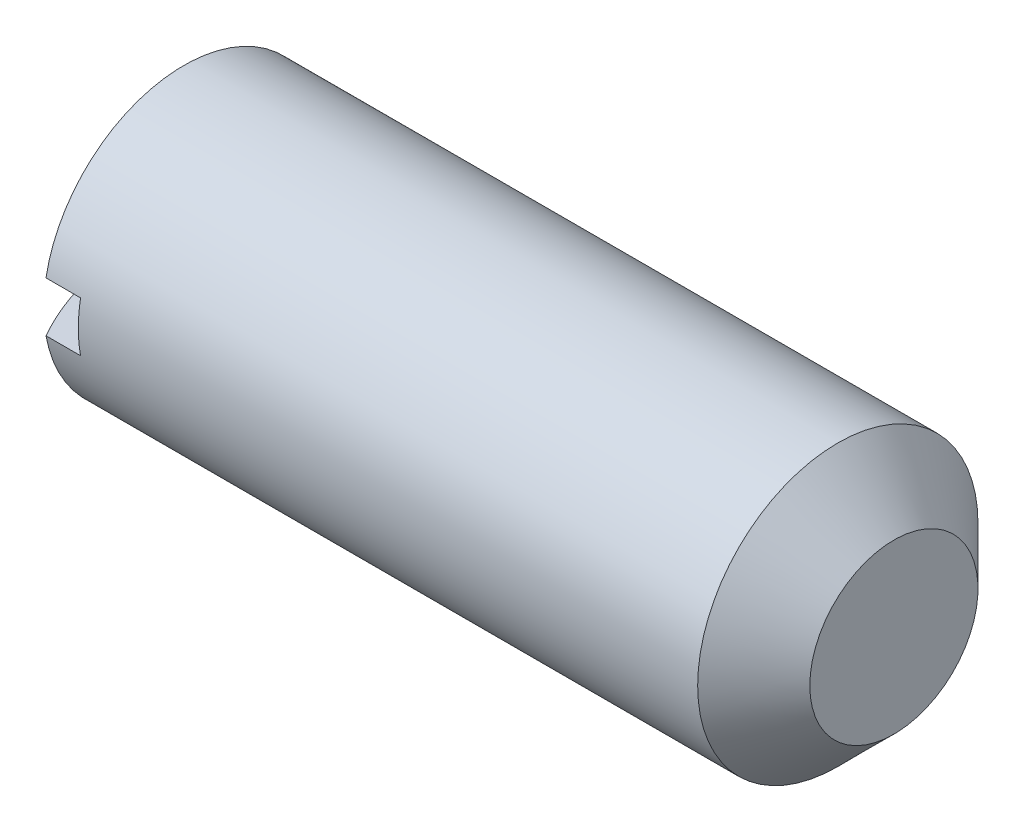
ISO-10303-21;
HEADER;
FILE_DESCRIPTION(('STEP AP214'),'2;1');
FILE_NAME('part.step','',(''),(''),'','','');
FILE_SCHEMA(('AUTOMOTIVE_DESIGN { 1 0 10303 214 1 1 1 1 }'));
ENDSEC;
DATA;
#1=APPLICATION_CONTEXT('core data for automotive mechanical design processes');
#2=APPLICATION_PROTOCOL_DEFINITION('international standard','automotive_design',2000,#1);
#3=PRODUCT_CONTEXT('',#1,'mechanical');
#4=PRODUCT('Part','Part','',(#3));
#5=PRODUCT_RELATED_PRODUCT_CATEGORY('part','',(#4));
#6=PRODUCT_DEFINITION_FORMATION('','',#4);
#7=PRODUCT_DEFINITION_CONTEXT('part definition',#1,'design');
#8=PRODUCT_DEFINITION('design','',#6,#7);
#9=PRODUCT_DEFINITION_SHAPE('','',#8);
#10=(LENGTH_UNIT() NAMED_UNIT(*) SI_UNIT(.MILLI.,.METRE.));
#11=(NAMED_UNIT(*) PLANE_ANGLE_UNIT() SI_UNIT($,.RADIAN.));
#12=(NAMED_UNIT(*) SI_UNIT($,.STERADIAN.) SOLID_ANGLE_UNIT());
#13=UNCERTAINTY_MEASURE_WITH_UNIT(LENGTH_MEASURE(1.E-05),#10,'distance_accuracy_value','');
#14=(GEOMETRIC_REPRESENTATION_CONTEXT(3) GLOBAL_UNCERTAINTY_ASSIGNED_CONTEXT((#13)) GLOBAL_UNIT_ASSIGNED_CONTEXT((#10,
#11,#12)) REPRESENTATION_CONTEXT('',''));
#15=CARTESIAN_POINT('',(0.,0.,0.));
#16=DIRECTION('',(0.,0.,1.));
#17=DIRECTION('',(1.,0.,0.));
#18=AXIS2_PLACEMENT_3D('',#15,#16,#17);
#19=CARTESIAN_POINT('',(19.05,0.,0.));
#20=DIRECTION('',(-1.,0.,0.));
#21=DIRECTION('',(0.,1.,0.));
#22=AXIS2_PLACEMENT_3D('',#19,#20,#21);
#23=SPHERICAL_SURFACE('',#22,19.05);
#24=CARTESIAN_POINT('',(19.05,1.7018,0.));
#25=DIRECTION('',(0.,-1.,0.));
#26=DIRECTION('',(0.,0.,-1.));
#27=AXIS2_PLACEMENT_3D('',#24,#25,#26);
#28=CIRCLE('',#27,18.9738340026469);
#29=CARTESIAN_POINT('',(2.55221605790645,1.7018,9.37173952689681));
#30=VERTEX_POINT('',#29);
#31=CARTESIAN_POINT('',(2.55221605790645,1.7018,-9.37173952689681));
#32=VERTEX_POINT('',#31);
#33=EDGE_CURVE('E94',#30,#32,#28,.T.);
#34=ORIENTED_EDGE('',*,*,#33,.F.);
#35=CARTESIAN_POINT('',(2.55221605790645,0.,0.));
#36=DIRECTION('',(-1.,0.,0.));
#37=DIRECTION('',(0.,0.,1.));
#38=AXIS2_PLACEMENT_3D('',#35,#36,#37);
#39=CIRCLE('',#38,9.525);
#40=EDGE_CURVE('E85',#30,#32,#39,.T.);
#41=ORIENTED_EDGE('',*,*,#40,.T.);
#42=EDGE_LOOP('',(#34,#41));
#43=FACE_BOUND('',#42,.T.);
#44=ADVANCED_FACE('F32',(#43),#23,.T.);
#45=CARTESIAN_POINT('',(19.05,-1.7018,0.));
#46=DIRECTION('',(0.,1.,0.));
#47=DIRECTION('',(0.,0.,1.));
#48=AXIS2_PLACEMENT_3D('',#45,#46,#47);
#49=CIRCLE('',#48,18.9738340026469);
#50=CARTESIAN_POINT('',(2.55221605790645,-1.7018,-9.37173952689681));
#51=VERTEX_POINT('',#50);
#52=CARTESIAN_POINT('',(2.55221605790645,-1.7018,9.37173952689681));
#53=VERTEX_POINT('',#52);
#54=EDGE_CURVE('E108',#51,#53,#49,.T.);
#55=ORIENTED_EDGE('',*,*,#54,.F.);
#56=EDGE_CURVE('E88',#51,#53,#39,.T.);
#57=ORIENTED_EDGE('',*,*,#56,.T.);
#58=EDGE_LOOP('',(#55,#57));
#59=FACE_BOUND('',#58,.T.);
#60=ADVANCED_FACE('F107',(#59),#23,.T.);
#61=CARTESIAN_POINT('',(-12.7,0.,0.));
#62=DIRECTION('',(-1.,0.,0.));
#63=DIRECTION('',(0.,0.,1.));
#64=AXIS2_PLACEMENT_3D('',#61,#62,#63);
#65=CYLINDRICAL_SURFACE('',#64,9.525);
#66=CARTESIAN_POINT('',(46.99,0.,0.));
#67=DIRECTION('',(-1.,0.,0.));
#68=DIRECTION('',(0.,0.,1.));
#69=AXIS2_PLACEMENT_3D('',#66,#67,#68);
#70=CIRCLE('',#69,9.525);
#71=CARTESIAN_POINT('',(46.99,0.,9.525));
#72=VERTEX_POINT('',#71);
#73=EDGE_CURVE('E87',#72,#72,#70,.T.);
#74=ORIENTED_EDGE('',*,*,#73,.T.);
#75=EDGE_LOOP('',(#74));
#76=FACE_BOUND('',#75,.T.);
#77=ORIENTED_EDGE('',*,*,#40,.F.);
#78=DIRECTION('',(-1.,0.,0.));
#79=VECTOR('',#78,1.);
#80=CARTESIAN_POINT('',(-12.7,1.7018,9.37173952689681));
#81=LINE('',#80,#79);
#82=CARTESIAN_POINT('',(4.9022,1.7018,9.37173952689681));
#83=VERTEX_POINT('',#82);
#84=EDGE_CURVE('E11',#30,#83,#81,.F.);
#85=ORIENTED_EDGE('',*,*,#84,.T.);
#86=CARTESIAN_POINT('',(4.9022,0.,0.));
#87=DIRECTION('',(1.,0.,0.));
#88=DIRECTION('',(0.,0.,-1.));
#89=AXIS2_PLACEMENT_3D('',#86,#87,#88);
#90=CIRCLE('',#89,9.525);
#91=CARTESIAN_POINT('',(4.9022,-1.7018,9.37173952689681));
#92=VERTEX_POINT('',#91);
#93=EDGE_CURVE('E68',#92,#83,#90,.F.);
#94=ORIENTED_EDGE('',*,*,#93,.F.);
#95=DIRECTION('',(-1.,0.,0.));
#96=VECTOR('',#95,1.);
#97=CARTESIAN_POINT('',(-12.7,-1.7018,9.37173952689681));
#98=LINE('',#97,#96);
#99=EDGE_CURVE('E39',#92,#53,#98,.T.);
#100=ORIENTED_EDGE('',*,*,#99,.T.);
#101=ORIENTED_EDGE('',*,*,#56,.F.);
#102=DIRECTION('',(-1.,0.,0.));
#103=VECTOR('',#102,1.);
#104=CARTESIAN_POINT('',(-12.7,-1.7018,-9.37173952689681));
#105=LINE('',#104,#103);
#106=CARTESIAN_POINT('',(4.9022,-1.7018,-9.37173952689681));
#107=VERTEX_POINT('',#106);
#108=EDGE_CURVE('E100',#51,#107,#105,.F.);
#109=ORIENTED_EDGE('',*,*,#108,.T.);
#110=CARTESIAN_POINT('',(4.9022,1.7018,-9.37173952689681));
#111=VERTEX_POINT('',#110);
#112=EDGE_CURVE('E77',#111,#107,#90,.F.);
#113=ORIENTED_EDGE('',*,*,#112,.F.);
#114=DIRECTION('',(-1.,0.,0.));
#115=VECTOR('',#114,1.);
#116=CARTESIAN_POINT('',(-12.7,1.7018,-9.37173952689681));
#117=LINE('',#116,#115);
#118=EDGE_CURVE('E75',#111,#32,#117,.T.);
#119=ORIENTED_EDGE('',*,*,#118,.T.);
#120=EDGE_LOOP('',(#77,#85,#94,#100,#101,#109,#113,#119));
#121=FACE_BOUND('',#120,.T.);
#122=ADVANCED_FACE('F83',(#76,#121),#65,.T.);
#123=CARTESIAN_POINT('',(50.8,0.,0.));
#124=DIRECTION('',(-1.,0.,0.));
#125=DIRECTION('',(0.,0.,1.));
#126=AXIS2_PLACEMENT_3D('',#123,#124,#125);
#127=PLANE('',#126);
#128=CARTESIAN_POINT('',(50.8,0.,0.));
#129=DIRECTION('',(-1.,0.,0.));
#130=DIRECTION('',(0.,0.,1.));
#131=AXIS2_PLACEMENT_3D('',#128,#129,#130);
#132=CIRCLE('',#131,5.715);
#133=CARTESIAN_POINT('',(50.8,0.,5.715));
#134=VERTEX_POINT('',#133);
#135=EDGE_CURVE('E91',#134,#134,#132,.T.);
#136=ORIENTED_EDGE('',*,*,#135,.F.);
#137=EDGE_LOOP('',(#136));
#138=FACE_BOUND('',#137,.T.);
#139=ADVANCED_FACE('F127',(#138),#127,.F.);
#140=CARTESIAN_POINT('',(50.8,0.,0.));
#141=DIRECTION('',(-1.,0.,0.));
#142=DIRECTION('',(0.,0.,1.));
#143=AXIS2_PLACEMENT_3D('',#140,#141,#142);
#144=CONICAL_SURFACE('',#143,5.715,0.785398163397447);
#145=ORIENTED_EDGE('',*,*,#73,.F.);
#146=EDGE_LOOP('',(#145));
#147=FACE_BOUND('',#146,.T.);
#148=ORIENTED_EDGE('',*,*,#135,.T.);
#149=EDGE_LOOP('',(#148));
#150=FACE_BOUND('',#149,.T.);
#151=ADVANCED_FACE('F118',(#147,#150),#144,.T.);
#152=CARTESIAN_POINT('',(4.9022,1.7018,-9.52499999999999));
#153=DIRECTION('',(0.,-1.,0.));
#154=DIRECTION('',(0.,0.,-1.));
#155=AXIS2_PLACEMENT_3D('',#152,#153,#154);
#156=PLANE('',#155);
#157=ORIENTED_EDGE('',*,*,#33,.T.);
#158=ORIENTED_EDGE('',*,*,#118,.F.);
#159=DIRECTION('',(0.,0.,1.));
#160=VECTOR('',#159,1.);
#161=CARTESIAN_POINT('',(4.9022,1.7018,-9.52499999999999));
#162=LINE('',#161,#160);
#163=EDGE_CURVE('E46',#111,#83,#162,.T.);
#164=ORIENTED_EDGE('',*,*,#163,.T.);
#165=ORIENTED_EDGE('',*,*,#84,.F.);
#166=EDGE_LOOP('',(#157,#158,#164,#165));
#167=FACE_BOUND('',#166,.T.);
#168=ADVANCED_FACE('F78',(#167),#156,.T.);
#169=CARTESIAN_POINT('',(4.9022,-1.7018,-9.52499999999999));
#170=DIRECTION('',(0.,1.,0.));
#171=DIRECTION('',(0.,0.,1.));
#172=AXIS2_PLACEMENT_3D('',#169,#170,#171);
#173=PLANE('',#172);
#174=ORIENTED_EDGE('',*,*,#54,.T.);
#175=ORIENTED_EDGE('',*,*,#99,.F.);
#176=DIRECTION('',(0.,0.,-1.));
#177=VECTOR('',#176,1.);
#178=CARTESIAN_POINT('',(4.9022,-1.7018,-9.52499999999999));
#179=LINE('',#178,#177);
#180=EDGE_CURVE('E71',#92,#107,#179,.T.);
#181=ORIENTED_EDGE('',*,*,#180,.T.);
#182=ORIENTED_EDGE('',*,*,#108,.F.);
#183=EDGE_LOOP('',(#174,#175,#181,#182));
#184=FACE_BOUND('',#183,.T.);
#185=ADVANCED_FACE('F110',(#184),#173,.T.);
#186=CARTESIAN_POINT('',(4.9022,1.7018,-9.52499999999999));
#187=DIRECTION('',(1.,0.,0.));
#188=DIRECTION('',(0.,0.,-1.));
#189=AXIS2_PLACEMENT_3D('',#186,#187,#188);
#190=PLANE('',#189);
#191=ORIENTED_EDGE('',*,*,#180,.F.);
#192=ORIENTED_EDGE('',*,*,#93,.T.);
#193=ORIENTED_EDGE('',*,*,#163,.F.);
#194=ORIENTED_EDGE('',*,*,#112,.T.);
#195=EDGE_LOOP('',(#191,#192,#193,#194));
#196=FACE_BOUND('',#195,.T.);
#197=ADVANCED_FACE('F69',(#196),#190,.F.);
#198=CLOSED_SHELL('',(#44,#60,#122,#139,#151,#168,#185,#197));
#199=MANIFOLD_SOLID_BREP('B2',#198);
#200=ADVANCED_BREP_SHAPE_REPRESENTATION('',(#18,#199),#14);
#201=SHAPE_DEFINITION_REPRESENTATION(#9,#200);
ENDSEC;
END-ISO-10303-21;
